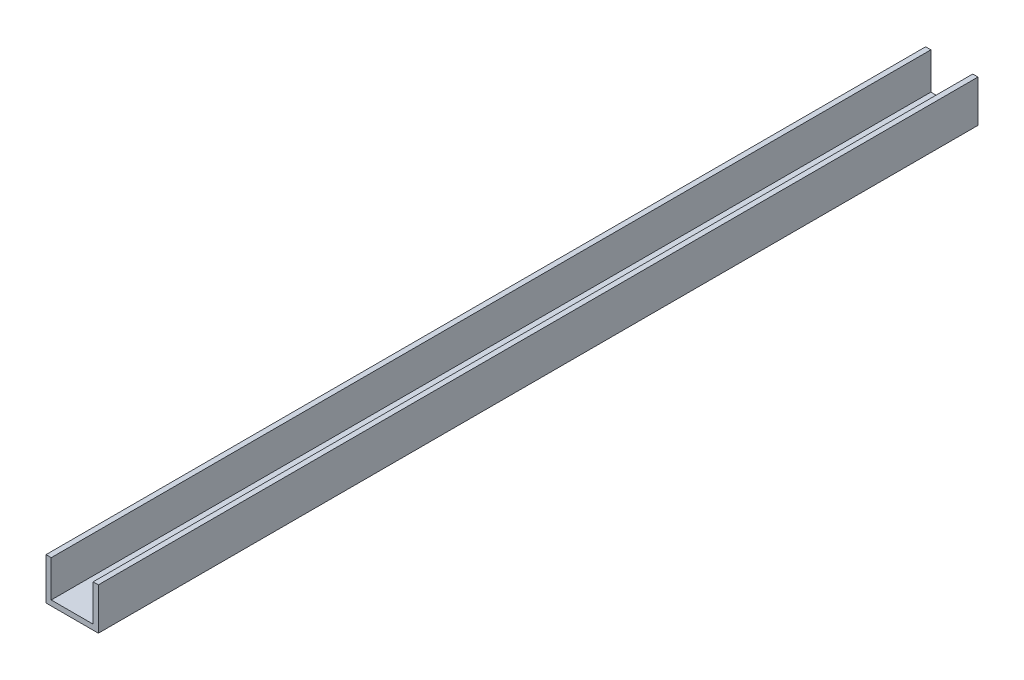
ISO-10303-21;
HEADER;
FILE_DESCRIPTION(('STEP AP214'),'2;1');
FILE_NAME('part.step','',(''),(''),'','','');
FILE_SCHEMA(('AUTOMOTIVE_DESIGN { 1 0 10303 214 1 1 1 1 }'));
ENDSEC;
DATA;
#1=APPLICATION_CONTEXT('core data for automotive mechanical design processes');
#2=APPLICATION_PROTOCOL_DEFINITION('international standard','automotive_design',2000,#1);
#3=PRODUCT_CONTEXT('',#1,'mechanical');
#4=PRODUCT('Part','Part','',(#3));
#5=PRODUCT_RELATED_PRODUCT_CATEGORY('part','',(#4));
#6=PRODUCT_DEFINITION_FORMATION('','',#4);
#7=PRODUCT_DEFINITION_CONTEXT('part definition',#1,'design');
#8=PRODUCT_DEFINITION('design','',#6,#7);
#9=PRODUCT_DEFINITION_SHAPE('','',#8);
#10=(LENGTH_UNIT() NAMED_UNIT(*) SI_UNIT(.MILLI.,.METRE.));
#11=(NAMED_UNIT(*) PLANE_ANGLE_UNIT() SI_UNIT($,.RADIAN.));
#12=(NAMED_UNIT(*) SI_UNIT($,.STERADIAN.) SOLID_ANGLE_UNIT());
#13=UNCERTAINTY_MEASURE_WITH_UNIT(LENGTH_MEASURE(1.E-05),#10,'distance_accuracy_value','');
#14=(GEOMETRIC_REPRESENTATION_CONTEXT(3) GLOBAL_UNCERTAINTY_ASSIGNED_CONTEXT((#13)) GLOBAL_UNIT_ASSIGNED_CONTEXT((#10,
#11,#12)) REPRESENTATION_CONTEXT('',''));
#15=CARTESIAN_POINT('',(0.,0.,0.));
#16=DIRECTION('',(0.,0.,1.));
#17=DIRECTION('',(1.,0.,0.));
#18=AXIS2_PLACEMENT_3D('',#15,#16,#17);
#19=CARTESIAN_POINT('',(15.875,0.,266.7));
#20=DIRECTION('',(0.,1.,0.));
#21=DIRECTION('',(-1.,0.,0.));
#22=AXIS2_PLACEMENT_3D('',#19,#20,#21);
#23=PLANE('',#22);
#24=DIRECTION('',(1.,0.,0.));
#25=VECTOR('',#24,1.);
#26=CARTESIAN_POINT('',(15.875,0.,0.));
#27=LINE('',#26,#25);
#28=CARTESIAN_POINT('',(0.,0.,0.));
#29=VERTEX_POINT('',#28);
#30=CARTESIAN_POINT('',(15.875,0.,0.));
#31=VERTEX_POINT('',#30);
#32=EDGE_CURVE('E137',#29,#31,#27,.T.);
#33=ORIENTED_EDGE('',*,*,#32,.T.);
#34=DIRECTION('',(0.,0.,-1.));
#35=VECTOR('',#34,1.);
#36=CARTESIAN_POINT('',(15.875,0.,266.7));
#37=LINE('',#36,#35);
#38=CARTESIAN_POINT('',(15.875,0.,266.7));
#39=VERTEX_POINT('',#38);
#40=EDGE_CURVE('E11',#39,#31,#37,.T.);
#41=ORIENTED_EDGE('',*,*,#40,.F.);
#42=DIRECTION('',(1.,0.,0.));
#43=VECTOR('',#42,1.);
#44=CARTESIAN_POINT('',(15.875,0.,266.7));
#45=LINE('',#44,#43);
#46=CARTESIAN_POINT('',(0.,0.,266.7));
#47=VERTEX_POINT('',#46);
#48=EDGE_CURVE('E151',#47,#39,#45,.T.);
#49=ORIENTED_EDGE('',*,*,#48,.F.);
#50=DIRECTION('',(0.,0.,-1.));
#51=VECTOR('',#50,1.);
#52=CARTESIAN_POINT('',(0.,0.,266.7));
#53=LINE('',#52,#51);
#54=EDGE_CURVE('E133',#47,#29,#53,.T.);
#55=ORIENTED_EDGE('',*,*,#54,.T.);
#56=EDGE_LOOP('',(#33,#41,#49,#55));
#57=FACE_BOUND('',#56,.T.);
#58=ADVANCED_FACE('F41',(#57),#23,.F.);
#59=CARTESIAN_POINT('',(15.875,12.7,266.7));
#60=DIRECTION('',(-1.,0.,0.));
#61=DIRECTION('',(0.,-1.,0.));
#62=AXIS2_PLACEMENT_3D('',#59,#60,#61);
#63=PLANE('',#62);
#64=DIRECTION('',(0.,1.,0.));
#65=VECTOR('',#64,1.);
#66=CARTESIAN_POINT('',(15.875,12.7,0.));
#67=LINE('',#66,#65);
#68=CARTESIAN_POINT('',(15.875,12.7,0.));
#69=VERTEX_POINT('',#68);
#70=EDGE_CURVE('E140',#31,#69,#67,.T.);
#71=ORIENTED_EDGE('',*,*,#70,.T.);
#72=DIRECTION('',(0.,0.,-1.));
#73=VECTOR('',#72,1.);
#74=CARTESIAN_POINT('',(15.875,12.7,266.7));
#75=LINE('',#74,#73);
#76=CARTESIAN_POINT('',(15.875,12.7,266.7));
#77=VERTEX_POINT('',#76);
#78=EDGE_CURVE('E49',#77,#69,#75,.T.);
#79=ORIENTED_EDGE('',*,*,#78,.F.);
#80=DIRECTION('',(0.,1.,0.));
#81=VECTOR('',#80,1.);
#82=CARTESIAN_POINT('',(15.875,12.7,266.7));
#83=LINE('',#82,#81);
#84=EDGE_CURVE('E100',#39,#77,#83,.T.);
#85=ORIENTED_EDGE('',*,*,#84,.F.);
#86=ORIENTED_EDGE('',*,*,#40,.T.);
#87=EDGE_LOOP('',(#71,#79,#85,#86));
#88=FACE_BOUND('',#87,.T.);
#89=ADVANCED_FACE('F186',(#88),#63,.F.);
#90=CARTESIAN_POINT('',(14.2875,12.7,266.7));
#91=DIRECTION('',(0.,-1.,0.));
#92=DIRECTION('',(0.,0.,-1.));
#93=AXIS2_PLACEMENT_3D('',#90,#91,#92);
#94=PLANE('',#93);
#95=DIRECTION('',(-1.,0.,0.));
#96=VECTOR('',#95,1.);
#97=CARTESIAN_POINT('',(14.2875,12.7,0.));
#98=LINE('',#97,#96);
#99=CARTESIAN_POINT('',(14.2875,12.7,0.));
#100=VERTEX_POINT('',#99);
#101=EDGE_CURVE('E142',#69,#100,#98,.T.);
#102=ORIENTED_EDGE('',*,*,#101,.T.);
#103=DIRECTION('',(0.,0.,-1.));
#104=VECTOR('',#103,1.);
#105=CARTESIAN_POINT('',(14.2875,12.7,266.7));
#106=LINE('',#105,#104);
#107=CARTESIAN_POINT('',(14.2875,12.7,266.7));
#108=VERTEX_POINT('',#107);
#109=EDGE_CURVE('E158',#108,#100,#106,.T.);
#110=ORIENTED_EDGE('',*,*,#109,.F.);
#111=DIRECTION('',(-1.,0.,0.));
#112=VECTOR('',#111,1.);
#113=CARTESIAN_POINT('',(14.2875,12.7,266.7));
#114=LINE('',#113,#112);
#115=EDGE_CURVE('E166',#77,#108,#114,.T.);
#116=ORIENTED_EDGE('',*,*,#115,.F.);
#117=ORIENTED_EDGE('',*,*,#78,.T.);
#118=EDGE_LOOP('',(#102,#110,#116,#117));
#119=FACE_BOUND('',#118,.T.);
#120=ADVANCED_FACE('F164',(#119),#94,.F.);
#121=CARTESIAN_POINT('',(14.2875,1.58749999999999,266.7));
#122=DIRECTION('',(1.,0.,0.));
#123=DIRECTION('',(0.,0.,-1.));
#124=AXIS2_PLACEMENT_3D('',#121,#122,#123);
#125=PLANE('',#124);
#126=DIRECTION('',(0.,-1.,0.));
#127=VECTOR('',#126,1.);
#128=CARTESIAN_POINT('',(14.2875,1.58749999999999,0.));
#129=LINE('',#128,#127);
#130=CARTESIAN_POINT('',(14.2875,1.58749999999999,0.));
#131=VERTEX_POINT('',#130);
#132=EDGE_CURVE('E144',#100,#131,#129,.T.);
#133=ORIENTED_EDGE('',*,*,#132,.T.);
#134=DIRECTION('',(0.,0.,-1.));
#135=VECTOR('',#134,1.);
#136=CARTESIAN_POINT('',(14.2875,1.58749999999999,266.7));
#137=LINE('',#136,#135);
#138=CARTESIAN_POINT('',(14.2875,1.58749999999999,266.7));
#139=VERTEX_POINT('',#138);
#140=EDGE_CURVE('E155',#139,#131,#137,.T.);
#141=ORIENTED_EDGE('',*,*,#140,.F.);
#142=DIRECTION('',(0.,-1.,0.));
#143=VECTOR('',#142,1.);
#144=CARTESIAN_POINT('',(14.2875,1.58749999999999,266.7));
#145=LINE('',#144,#143);
#146=EDGE_CURVE('E178',#108,#139,#145,.T.);
#147=ORIENTED_EDGE('',*,*,#146,.F.);
#148=ORIENTED_EDGE('',*,*,#109,.T.);
#149=EDGE_LOOP('',(#133,#141,#147,#148));
#150=FACE_BOUND('',#149,.T.);
#151=ADVANCED_FACE('F174',(#150),#125,.F.);
#152=CARTESIAN_POINT('',(1.5875,1.58749999999999,266.7));
#153=DIRECTION('',(0.,-1.,0.));
#154=DIRECTION('',(0.,0.,-1.));
#155=AXIS2_PLACEMENT_3D('',#152,#153,#154);
#156=PLANE('',#155);
#157=DIRECTION('',(-1.,0.,0.));
#158=VECTOR('',#157,1.);
#159=CARTESIAN_POINT('',(1.5875,1.58749999999999,0.));
#160=LINE('',#159,#158);
#161=CARTESIAN_POINT('',(1.5875,1.58749999999999,0.));
#162=VERTEX_POINT('',#161);
#163=EDGE_CURVE('E146',#131,#162,#160,.T.);
#164=ORIENTED_EDGE('',*,*,#163,.T.);
#165=DIRECTION('',(0.,0.,-1.));
#166=VECTOR('',#165,1.);
#167=CARTESIAN_POINT('',(1.5875,1.58749999999999,266.7));
#168=LINE('',#167,#166);
#169=CARTESIAN_POINT('',(1.5875,1.58749999999999,266.7));
#170=VERTEX_POINT('',#169);
#171=EDGE_CURVE('E128',#170,#162,#168,.T.);
#172=ORIENTED_EDGE('',*,*,#171,.F.);
#173=DIRECTION('',(-1.,0.,0.));
#174=VECTOR('',#173,1.);
#175=CARTESIAN_POINT('',(1.5875,1.58749999999999,266.7));
#176=LINE('',#175,#174);
#177=EDGE_CURVE('E119',#139,#170,#176,.T.);
#178=ORIENTED_EDGE('',*,*,#177,.F.);
#179=ORIENTED_EDGE('',*,*,#140,.T.);
#180=EDGE_LOOP('',(#164,#172,#178,#179));
#181=FACE_BOUND('',#180,.T.);
#182=ADVANCED_FACE('F177',(#181),#156,.F.);
#183=CARTESIAN_POINT('',(1.5875,12.7,266.7));
#184=DIRECTION('',(-1.,0.,0.));
#185=DIRECTION('',(0.,-1.,0.));
#186=AXIS2_PLACEMENT_3D('',#183,#184,#185);
#187=PLANE('',#186);
#188=DIRECTION('',(0.,1.,0.));
#189=VECTOR('',#188,1.);
#190=CARTESIAN_POINT('',(1.5875,12.7,0.));
#191=LINE('',#190,#189);
#192=CARTESIAN_POINT('',(1.5875,12.7,0.));
#193=VERTEX_POINT('',#192);
#194=EDGE_CURVE('E127',#162,#193,#191,.T.);
#195=ORIENTED_EDGE('',*,*,#194,.T.);
#196=DIRECTION('',(0.,0.,-1.));
#197=VECTOR('',#196,1.);
#198=CARTESIAN_POINT('',(1.5875,12.7,266.7));
#199=LINE('',#198,#197);
#200=CARTESIAN_POINT('',(1.5875,12.7,266.7));
#201=VERTEX_POINT('',#200);
#202=EDGE_CURVE('E124',#201,#193,#199,.T.);
#203=ORIENTED_EDGE('',*,*,#202,.F.);
#204=DIRECTION('',(0.,1.,0.));
#205=VECTOR('',#204,1.);
#206=CARTESIAN_POINT('',(1.5875,12.7,266.7));
#207=LINE('',#206,#205);
#208=EDGE_CURVE('E113',#170,#201,#207,.T.);
#209=ORIENTED_EDGE('',*,*,#208,.F.);
#210=ORIENTED_EDGE('',*,*,#171,.T.);
#211=EDGE_LOOP('',(#195,#203,#209,#210));
#212=FACE_BOUND('',#211,.T.);
#213=ADVANCED_FACE('F125',(#212),#187,.F.);
#214=CARTESIAN_POINT('',(0.,12.7,266.7));
#215=DIRECTION('',(0.,-1.,0.));
#216=DIRECTION('',(0.,0.,-1.));
#217=AXIS2_PLACEMENT_3D('',#214,#215,#216);
#218=PLANE('',#217);
#219=DIRECTION('',(-1.,0.,0.));
#220=VECTOR('',#219,1.);
#221=CARTESIAN_POINT('',(0.,12.7,0.));
#222=LINE('',#221,#220);
#223=CARTESIAN_POINT('',(0.,12.7,0.));
#224=VERTEX_POINT('',#223);
#225=EDGE_CURVE('E86',#193,#224,#222,.T.);
#226=ORIENTED_EDGE('',*,*,#225,.T.);
#227=DIRECTION('',(0.,0.,-1.));
#228=VECTOR('',#227,1.);
#229=CARTESIAN_POINT('',(0.,12.7,266.7));
#230=LINE('',#229,#228);
#231=CARTESIAN_POINT('',(0.,12.7,266.7));
#232=VERTEX_POINT('',#231);
#233=EDGE_CURVE('E129',#232,#224,#230,.T.);
#234=ORIENTED_EDGE('',*,*,#233,.F.);
#235=DIRECTION('',(-1.,0.,0.));
#236=VECTOR('',#235,1.);
#237=CARTESIAN_POINT('',(0.,12.7,266.7));
#238=LINE('',#237,#236);
#239=EDGE_CURVE('E117',#201,#232,#238,.T.);
#240=ORIENTED_EDGE('',*,*,#239,.F.);
#241=ORIENTED_EDGE('',*,*,#202,.T.);
#242=EDGE_LOOP('',(#226,#234,#240,#241));
#243=FACE_BOUND('',#242,.T.);
#244=ADVANCED_FACE('F131',(#243),#218,.F.);
#245=CARTESIAN_POINT('',(0.,0.,266.7));
#246=DIRECTION('',(1.,0.,0.));
#247=DIRECTION('',(0.,0.,-1.));
#248=AXIS2_PLACEMENT_3D('',#245,#246,#247);
#249=PLANE('',#248);
#250=DIRECTION('',(0.,-1.,0.));
#251=VECTOR('',#250,1.);
#252=CARTESIAN_POINT('',(0.,0.,0.));
#253=LINE('',#252,#251);
#254=EDGE_CURVE('E92',#224,#29,#253,.T.);
#255=ORIENTED_EDGE('',*,*,#254,.T.);
#256=ORIENTED_EDGE('',*,*,#54,.F.);
#257=DIRECTION('',(0.,-1.,0.));
#258=VECTOR('',#257,1.);
#259=CARTESIAN_POINT('',(0.,0.,266.7));
#260=LINE('',#259,#258);
#261=EDGE_CURVE('E57',#232,#47,#260,.T.);
#262=ORIENTED_EDGE('',*,*,#261,.F.);
#263=ORIENTED_EDGE('',*,*,#233,.T.);
#264=EDGE_LOOP('',(#255,#256,#262,#263));
#265=FACE_BOUND('',#264,.T.);
#266=ADVANCED_FACE('F202',(#265),#249,.F.);
#267=CARTESIAN_POINT('',(0.,0.,266.7));
#268=DIRECTION('',(0.,0.,-1.));
#269=DIRECTION('',(-1.,0.,0.));
#270=AXIS2_PLACEMENT_3D('',#267,#268,#269);
#271=PLANE('',#270);
#272=ORIENTED_EDGE('',*,*,#48,.T.);
#273=ORIENTED_EDGE('',*,*,#84,.T.);
#274=ORIENTED_EDGE('',*,*,#115,.T.);
#275=ORIENTED_EDGE('',*,*,#146,.T.);
#276=ORIENTED_EDGE('',*,*,#177,.T.);
#277=ORIENTED_EDGE('',*,*,#208,.T.);
#278=ORIENTED_EDGE('',*,*,#239,.T.);
#279=ORIENTED_EDGE('',*,*,#261,.T.);
#280=EDGE_LOOP('',(#272,#273,#274,#275,#276,#277,#278,#279));
#281=FACE_BOUND('',#280,.T.);
#282=ADVANCED_FACE('F115',(#281),#271,.F.);
#283=CARTESIAN_POINT('',(0.,0.,0.));
#284=DIRECTION('',(0.,0.,-1.));
#285=DIRECTION('',(-1.,0.,0.));
#286=AXIS2_PLACEMENT_3D('',#283,#284,#285);
#287=PLANE('',#286);
#288=ORIENTED_EDGE('',*,*,#32,.F.);
#289=ORIENTED_EDGE('',*,*,#254,.F.);
#290=ORIENTED_EDGE('',*,*,#225,.F.);
#291=ORIENTED_EDGE('',*,*,#194,.F.);
#292=ORIENTED_EDGE('',*,*,#163,.F.);
#293=ORIENTED_EDGE('',*,*,#132,.F.);
#294=ORIENTED_EDGE('',*,*,#101,.F.);
#295=ORIENTED_EDGE('',*,*,#70,.F.);
#296=EDGE_LOOP('',(#288,#289,#290,#291,#292,#293,#294,#295));
#297=FACE_BOUND('',#296,.T.);
#298=ADVANCED_FACE('F170',(#297),#287,.T.);
#299=CLOSED_SHELL('',(#58,#89,#120,#151,#182,#213,#244,#266,#282,#298));
#300=MANIFOLD_SOLID_BREP('B2',#299);
#301=ADVANCED_BREP_SHAPE_REPRESENTATION('',(#18,#300),#14);
#302=SHAPE_DEFINITION_REPRESENTATION(#9,#301);
ENDSEC;
END-ISO-10303-21;
